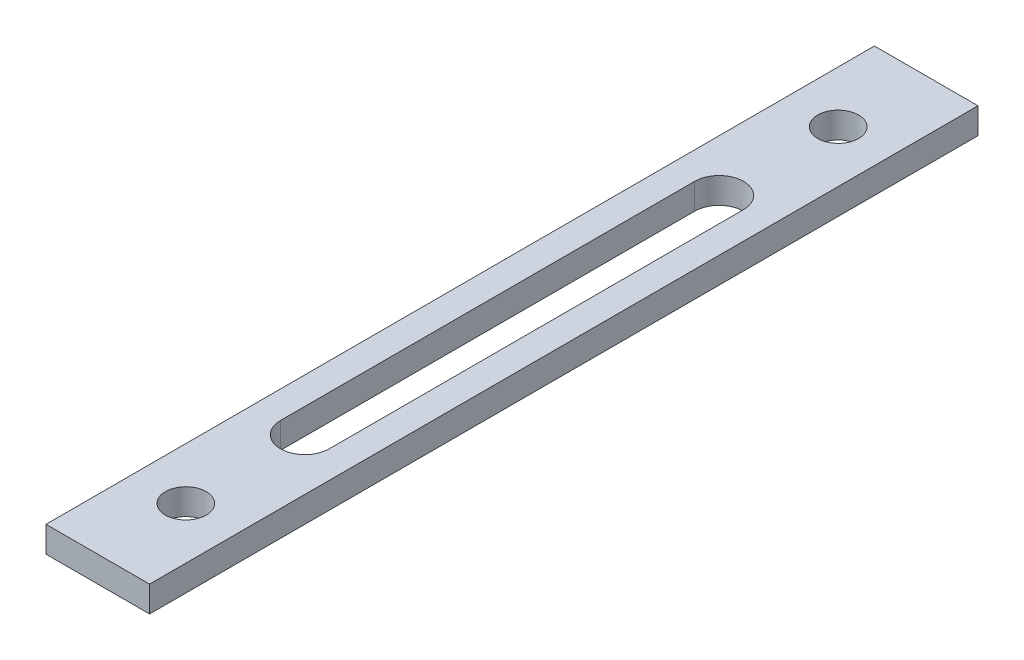
ISO-10303-21;
HEADER;
FILE_DESCRIPTION(('STEP AP214'),'2;1');
FILE_NAME('part.step','',(''),(''),'','','');
FILE_SCHEMA(('AUTOMOTIVE_DESIGN { 1 0 10303 214 1 1 1 1 }'));
ENDSEC;
DATA;
#1=APPLICATION_CONTEXT('core data for automotive mechanical design processes');
#2=APPLICATION_PROTOCOL_DEFINITION('international standard','automotive_design',2000,#1);
#3=PRODUCT_CONTEXT('',#1,'mechanical');
#4=PRODUCT('Part','Part','',(#3));
#5=PRODUCT_RELATED_PRODUCT_CATEGORY('part','',(#4));
#6=PRODUCT_DEFINITION_FORMATION('','',#4);
#7=PRODUCT_DEFINITION_CONTEXT('part definition',#1,'design');
#8=PRODUCT_DEFINITION('design','',#6,#7);
#9=PRODUCT_DEFINITION_SHAPE('','',#8);
#10=(LENGTH_UNIT() NAMED_UNIT(*) SI_UNIT(.MILLI.,.METRE.));
#11=(NAMED_UNIT(*) PLANE_ANGLE_UNIT() SI_UNIT($,.RADIAN.));
#12=(NAMED_UNIT(*) SI_UNIT($,.STERADIAN.) SOLID_ANGLE_UNIT());
#13=UNCERTAINTY_MEASURE_WITH_UNIT(LENGTH_MEASURE(1.E-05),#10,'distance_accuracy_value','');
#14=(GEOMETRIC_REPRESENTATION_CONTEXT(3) GLOBAL_UNCERTAINTY_ASSIGNED_CONTEXT((#13)) GLOBAL_UNIT_ASSIGNED_CONTEXT((#10,
#11,#12)) REPRESENTATION_CONTEXT('',''));
#15=CARTESIAN_POINT('',(0.,0.,0.));
#16=DIRECTION('',(0.,0.,1.));
#17=DIRECTION('',(1.,0.,0.));
#18=AXIS2_PLACEMENT_3D('',#15,#16,#17);
#19=CARTESIAN_POINT('',(-12.7,6.35,-101.6));
#20=DIRECTION('',(1.,0.,0.));
#21=DIRECTION('',(0.,0.,-1.));
#22=AXIS2_PLACEMENT_3D('',#19,#20,#21);
#23=PLANE('',#22);
#24=DIRECTION('',(0.,0.,1.));
#25=VECTOR('',#24,1.);
#26=CARTESIAN_POINT('',(-12.7,0.,-101.6));
#27=LINE('',#26,#25);
#28=CARTESIAN_POINT('',(-12.7,0.,-101.6));
#29=VERTEX_POINT('',#28);
#30=CARTESIAN_POINT('',(-12.7,0.,101.6));
#31=VERTEX_POINT('',#30);
#32=EDGE_CURVE('E142',#29,#31,#27,.T.);
#33=ORIENTED_EDGE('',*,*,#32,.T.);
#34=DIRECTION('',(0.,-1.,0.));
#35=VECTOR('',#34,1.);
#36=CARTESIAN_POINT('',(-12.7,6.35,101.6));
#37=LINE('',#36,#35);
#38=CARTESIAN_POINT('',(-12.7,6.35,101.6));
#39=VERTEX_POINT('',#38);
#40=EDGE_CURVE('E11',#39,#31,#37,.T.);
#41=ORIENTED_EDGE('',*,*,#40,.F.);
#42=DIRECTION('',(0.,0.,1.));
#43=VECTOR('',#42,1.);
#44=CARTESIAN_POINT('',(-12.7,6.35,-101.6));
#45=LINE('',#44,#43);
#46=CARTESIAN_POINT('',(-12.7,6.35,-101.6));
#47=VERTEX_POINT('',#46);
#48=EDGE_CURVE('E151',#47,#39,#45,.T.);
#49=ORIENTED_EDGE('',*,*,#48,.F.);
#50=DIRECTION('',(0.,-1.,0.));
#51=VECTOR('',#50,1.);
#52=CARTESIAN_POINT('',(-12.7,6.35,-101.6));
#53=LINE('',#52,#51);
#54=EDGE_CURVE('E161',#47,#29,#53,.T.);
#55=ORIENTED_EDGE('',*,*,#54,.T.);
#56=EDGE_LOOP('',(#33,#41,#49,#55));
#57=FACE_BOUND('',#56,.T.);
#58=ADVANCED_FACE('F38',(#57),#23,.F.);
#59=CARTESIAN_POINT('',(12.7,6.35,101.6));
#60=DIRECTION('',(0.,0.,-1.));
#61=DIRECTION('',(-1.,0.,0.));
#62=AXIS2_PLACEMENT_3D('',#59,#60,#61);
#63=PLANE('',#62);
#64=DIRECTION('',(1.,0.,0.));
#65=VECTOR('',#64,1.);
#66=CARTESIAN_POINT('',(12.7,0.,101.6));
#67=LINE('',#66,#65);
#68=CARTESIAN_POINT('',(12.7,0.,101.6));
#69=VERTEX_POINT('',#68);
#70=EDGE_CURVE('E164',#31,#69,#67,.T.);
#71=ORIENTED_EDGE('',*,*,#70,.T.);
#72=DIRECTION('',(0.,-1.,0.));
#73=VECTOR('',#72,1.);
#74=CARTESIAN_POINT('',(12.7,6.35,101.6));
#75=LINE('',#74,#73);
#76=CARTESIAN_POINT('',(12.7,6.35,101.6));
#77=VERTEX_POINT('',#76);
#78=EDGE_CURVE('E45',#77,#69,#75,.T.);
#79=ORIENTED_EDGE('',*,*,#78,.F.);
#80=DIRECTION('',(1.,0.,0.));
#81=VECTOR('',#80,1.);
#82=CARTESIAN_POINT('',(12.7,6.35,101.6));
#83=LINE('',#82,#81);
#84=EDGE_CURVE('E154',#39,#77,#83,.T.);
#85=ORIENTED_EDGE('',*,*,#84,.F.);
#86=ORIENTED_EDGE('',*,*,#40,.T.);
#87=EDGE_LOOP('',(#71,#79,#85,#86));
#88=FACE_BOUND('',#87,.T.);
#89=ADVANCED_FACE('F193',(#88),#63,.F.);
#90=CARTESIAN_POINT('',(12.7,6.35,-101.6));
#91=DIRECTION('',(-1.,0.,0.));
#92=DIRECTION('',(0.,0.,1.));
#93=AXIS2_PLACEMENT_3D('',#90,#91,#92);
#94=PLANE('',#93);
#95=DIRECTION('',(0.,0.,-1.));
#96=VECTOR('',#95,1.);
#97=CARTESIAN_POINT('',(12.7,0.,-101.6));
#98=LINE('',#97,#96);
#99=CARTESIAN_POINT('',(12.7,0.,-101.6));
#100=VERTEX_POINT('',#99);
#101=EDGE_CURVE('E166',#69,#100,#98,.T.);
#102=ORIENTED_EDGE('',*,*,#101,.T.);
#103=DIRECTION('',(0.,-1.,0.));
#104=VECTOR('',#103,1.);
#105=CARTESIAN_POINT('',(12.7,6.35,-101.6));
#106=LINE('',#105,#104);
#107=CARTESIAN_POINT('',(12.7,6.35,-101.6));
#108=VERTEX_POINT('',#107);
#109=EDGE_CURVE('E171',#108,#100,#106,.T.);
#110=ORIENTED_EDGE('',*,*,#109,.F.);
#111=DIRECTION('',(0.,0.,-1.));
#112=VECTOR('',#111,1.);
#113=CARTESIAN_POINT('',(12.7,6.35,-101.6));
#114=LINE('',#113,#112);
#115=EDGE_CURVE('E157',#77,#108,#114,.T.);
#116=ORIENTED_EDGE('',*,*,#115,.F.);
#117=ORIENTED_EDGE('',*,*,#78,.T.);
#118=EDGE_LOOP('',(#102,#110,#116,#117));
#119=FACE_BOUND('',#118,.T.);
#120=ADVANCED_FACE('F178',(#119),#94,.F.);
#121=CARTESIAN_POINT('',(12.7,6.35,-101.6));
#122=DIRECTION('',(0.,0.,1.));
#123=DIRECTION('',(1.,0.,0.));
#124=AXIS2_PLACEMENT_3D('',#121,#122,#123);
#125=PLANE('',#124);
#126=DIRECTION('',(-1.,0.,0.));
#127=VECTOR('',#126,1.);
#128=CARTESIAN_POINT('',(12.7,0.,-101.6));
#129=LINE('',#128,#127);
#130=EDGE_CURVE('E155',#100,#29,#129,.T.);
#131=ORIENTED_EDGE('',*,*,#130,.T.);
#132=ORIENTED_EDGE('',*,*,#54,.F.);
#133=DIRECTION('',(-1.,0.,0.));
#134=VECTOR('',#133,1.);
#135=CARTESIAN_POINT('',(12.7,6.35,-101.6));
#136=LINE('',#135,#134);
#137=EDGE_CURVE('E159',#108,#47,#136,.T.);
#138=ORIENTED_EDGE('',*,*,#137,.F.);
#139=ORIENTED_EDGE('',*,*,#109,.T.);
#140=EDGE_LOOP('',(#131,#132,#138,#139));
#141=FACE_BOUND('',#140,.T.);
#142=ADVANCED_FACE('F186',(#141),#125,.F.);
#143=CARTESIAN_POINT('',(0.,6.35,0.));
#144=DIRECTION('',(0.,-1.,0.));
#145=DIRECTION('',(0.,0.,-1.));
#146=AXIS2_PLACEMENT_3D('',#143,#144,#145);
#147=PLANE('',#146);
#148=DIRECTION('',(0.,0.,1.));
#149=VECTOR('',#148,1.);
#150=CARTESIAN_POINT('',(-6.00000000000002,6.35,-50.8));
#151=LINE('',#150,#149);
#152=CARTESIAN_POINT('',(-6.00000000000002,6.35,-50.8));
#153=VERTEX_POINT('',#152);
#154=CARTESIAN_POINT('',(-5.99999999999999,6.35,50.8));
#155=VERTEX_POINT('',#154);
#156=EDGE_CURVE('E129',#153,#155,#151,.T.);
#157=ORIENTED_EDGE('',*,*,#156,.F.);
#158=CARTESIAN_POINT('',(0.,6.35,-50.8));
#159=DIRECTION('',(0.,1.,0.));
#160=DIRECTION('',(0.,0.,1.));
#161=AXIS2_PLACEMENT_3D('',#158,#159,#160);
#162=CIRCLE('',#161,6.);
#163=CARTESIAN_POINT('',(5.99999999999998,6.35,-50.8));
#164=VERTEX_POINT('',#163);
#165=EDGE_CURVE('E52',#164,#153,#162,.T.);
#166=ORIENTED_EDGE('',*,*,#165,.F.);
#167=DIRECTION('',(0.,0.,-1.));
#168=VECTOR('',#167,1.);
#169=CARTESIAN_POINT('',(5.99999999999998,6.35,-50.8));
#170=LINE('',#169,#168);
#171=CARTESIAN_POINT('',(6.00000000000001,6.35,50.8));
#172=VERTEX_POINT('',#171);
#173=EDGE_CURVE('E120',#172,#164,#170,.T.);
#174=ORIENTED_EDGE('',*,*,#173,.F.);
#175=CARTESIAN_POINT('',(0.,6.35,50.8));
#176=DIRECTION('',(0.,1.,0.));
#177=DIRECTION('',(0.,0.,1.));
#178=AXIS2_PLACEMENT_3D('',#175,#176,#177);
#179=CIRCLE('',#178,6.);
#180=EDGE_CURVE('E123',#155,#172,#179,.T.);
#181=ORIENTED_EDGE('',*,*,#180,.F.);
#182=EDGE_LOOP('',(#157,#166,#174,#181));
#183=FACE_BOUND('',#182,.T.);
#184=CARTESIAN_POINT('',(0.,6.35,80.));
#185=DIRECTION('',(0.,1.,0.));
#186=DIRECTION('',(0.,0.,1.));
#187=AXIS2_PLACEMENT_3D('',#184,#185,#186);
#188=CIRCLE('',#187,5.);
#189=CARTESIAN_POINT('',(0.,6.35,85.));
#190=VERTEX_POINT('',#189);
#191=EDGE_CURVE('E143',#190,#190,#188,.T.);
#192=ORIENTED_EDGE('',*,*,#191,.F.);
#193=EDGE_LOOP('',(#192));
#194=FACE_BOUND('',#193,.T.);
#195=CARTESIAN_POINT('',(0.,6.35,-80.));
#196=DIRECTION('',(0.,1.,0.));
#197=DIRECTION('',(0.,0.,1.));
#198=AXIS2_PLACEMENT_3D('',#195,#196,#197);
#199=CIRCLE('',#198,5.);
#200=CARTESIAN_POINT('',(0.,6.35,-75.));
#201=VERTEX_POINT('',#200);
#202=EDGE_CURVE('E135',#201,#201,#199,.T.);
#203=ORIENTED_EDGE('',*,*,#202,.F.);
#204=EDGE_LOOP('',(#203));
#205=FACE_BOUND('',#204,.T.);
#206=ORIENTED_EDGE('',*,*,#48,.T.);
#207=ORIENTED_EDGE('',*,*,#84,.T.);
#208=ORIENTED_EDGE('',*,*,#115,.T.);
#209=ORIENTED_EDGE('',*,*,#137,.T.);
#210=EDGE_LOOP('',(#206,#207,#208,#209));
#211=FACE_BOUND('',#210,.T.);
#212=ADVANCED_FACE('F192',(#183,#194,#205,#211),#147,.F.);
#213=CARTESIAN_POINT('',(0.,0.,0.));
#214=DIRECTION('',(0.,-1.,0.));
#215=DIRECTION('',(0.,0.,-1.));
#216=AXIS2_PLACEMENT_3D('',#213,#214,#215);
#217=PLANE('',#216);
#218=CARTESIAN_POINT('',(0.,0.,-50.8));
#219=DIRECTION('',(0.,1.,0.));
#220=DIRECTION('',(0.,0.,1.));
#221=AXIS2_PLACEMENT_3D('',#218,#219,#220);
#222=CIRCLE('',#221,6.);
#223=CARTESIAN_POINT('',(5.99999999999998,0.,-50.8));
#224=VERTEX_POINT('',#223);
#225=CARTESIAN_POINT('',(-6.00000000000002,0.,-50.8));
#226=VERTEX_POINT('',#225);
#227=EDGE_CURVE('E104',#224,#226,#222,.T.);
#228=ORIENTED_EDGE('',*,*,#227,.T.);
#229=DIRECTION('',(0.,0.,1.));
#230=VECTOR('',#229,1.);
#231=CARTESIAN_POINT('',(-6.00000000000002,0.,-50.8));
#232=LINE('',#231,#230);
#233=CARTESIAN_POINT('',(-5.99999999999999,0.,50.8));
#234=VERTEX_POINT('',#233);
#235=EDGE_CURVE('E113',#226,#234,#232,.T.);
#236=ORIENTED_EDGE('',*,*,#235,.T.);
#237=CARTESIAN_POINT('',(0.,0.,50.8));
#238=DIRECTION('',(0.,1.,0.));
#239=DIRECTION('',(0.,0.,1.));
#240=AXIS2_PLACEMENT_3D('',#237,#238,#239);
#241=CIRCLE('',#240,6.);
#242=CARTESIAN_POINT('',(6.00000000000001,0.,50.8));
#243=VERTEX_POINT('',#242);
#244=EDGE_CURVE('E60',#234,#243,#241,.T.);
#245=ORIENTED_EDGE('',*,*,#244,.T.);
#246=DIRECTION('',(0.,0.,-1.));
#247=VECTOR('',#246,1.);
#248=CARTESIAN_POINT('',(5.99999999999998,0.,-50.8));
#249=LINE('',#248,#247);
#250=EDGE_CURVE('E110',#243,#224,#249,.T.);
#251=ORIENTED_EDGE('',*,*,#250,.T.);
#252=EDGE_LOOP('',(#228,#236,#245,#251));
#253=FACE_BOUND('',#252,.T.);
#254=CARTESIAN_POINT('',(0.,0.,80.));
#255=DIRECTION('',(0.,1.,0.));
#256=DIRECTION('',(0.,0.,1.));
#257=AXIS2_PLACEMENT_3D('',#254,#255,#256);
#258=CIRCLE('',#257,5.);
#259=CARTESIAN_POINT('',(0.,0.,85.));
#260=VERTEX_POINT('',#259);
#261=EDGE_CURVE('E139',#260,#260,#258,.T.);
#262=ORIENTED_EDGE('',*,*,#261,.T.);
#263=EDGE_LOOP('',(#262));
#264=FACE_BOUND('',#263,.T.);
#265=CARTESIAN_POINT('',(0.,0.,-80.));
#266=DIRECTION('',(0.,1.,0.));
#267=DIRECTION('',(0.,0.,1.));
#268=AXIS2_PLACEMENT_3D('',#265,#266,#267);
#269=CIRCLE('',#268,5.);
#270=CARTESIAN_POINT('',(0.,0.,-75.));
#271=VERTEX_POINT('',#270);
#272=EDGE_CURVE('E146',#271,#271,#269,.T.);
#273=ORIENTED_EDGE('',*,*,#272,.T.);
#274=EDGE_LOOP('',(#273));
#275=FACE_BOUND('',#274,.T.);
#276=ORIENTED_EDGE('',*,*,#32,.F.);
#277=ORIENTED_EDGE('',*,*,#130,.F.);
#278=ORIENTED_EDGE('',*,*,#101,.F.);
#279=ORIENTED_EDGE('',*,*,#70,.F.);
#280=EDGE_LOOP('',(#276,#277,#278,#279));
#281=FACE_BOUND('',#280,.T.);
#282=ADVANCED_FACE('F117',(#253,#264,#275,#281),#217,.T.);
#283=CARTESIAN_POINT('',(0.,0.,-80.));
#284=DIRECTION('',(0.,1.,0.));
#285=DIRECTION('',(0.,0.,1.));
#286=AXIS2_PLACEMENT_3D('',#283,#284,#285);
#287=CYLINDRICAL_SURFACE('',#286,5.);
#288=ORIENTED_EDGE('',*,*,#272,.F.);
#289=EDGE_LOOP('',(#288));
#290=FACE_BOUND('',#289,.T.);
#291=ORIENTED_EDGE('',*,*,#202,.T.);
#292=EDGE_LOOP('',(#291));
#293=FACE_BOUND('',#292,.T.);
#294=ADVANCED_FACE('F205',(#290,#293),#287,.F.);
#295=CARTESIAN_POINT('',(0.,0.,80.));
#296=DIRECTION('',(0.,1.,0.));
#297=DIRECTION('',(0.,0.,1.));
#298=AXIS2_PLACEMENT_3D('',#295,#296,#297);
#299=CYLINDRICAL_SURFACE('',#298,5.);
#300=ORIENTED_EDGE('',*,*,#261,.F.);
#301=EDGE_LOOP('',(#300));
#302=FACE_BOUND('',#301,.T.);
#303=ORIENTED_EDGE('',*,*,#191,.T.);
#304=EDGE_LOOP('',(#303));
#305=FACE_BOUND('',#304,.T.);
#306=ADVANCED_FACE('F211',(#302,#305),#299,.F.);
#307=CARTESIAN_POINT('',(0.,0.,-50.8));
#308=DIRECTION('',(0.,1.,0.));
#309=DIRECTION('',(0.,0.,1.));
#310=AXIS2_PLACEMENT_3D('',#307,#308,#309);
#311=CYLINDRICAL_SURFACE('',#310,6.);
#312=ORIENTED_EDGE('',*,*,#165,.T.);
#313=DIRECTION('',(0.,1.,0.));
#314=VECTOR('',#313,1.);
#315=CARTESIAN_POINT('',(-6.00000000000002,0.,-50.8));
#316=LINE('',#315,#314);
#317=EDGE_CURVE('E100',#226,#153,#316,.T.);
#318=ORIENTED_EDGE('',*,*,#317,.F.);
#319=ORIENTED_EDGE('',*,*,#227,.F.);
#320=DIRECTION('',(0.,1.,0.));
#321=VECTOR('',#320,1.);
#322=CARTESIAN_POINT('',(5.99999999999998,0.,-50.8));
#323=LINE('',#322,#321);
#324=EDGE_CURVE('E133',#224,#164,#323,.T.);
#325=ORIENTED_EDGE('',*,*,#324,.T.);
#326=EDGE_LOOP('',(#312,#318,#319,#325));
#327=FACE_BOUND('',#326,.T.);
#328=ADVANCED_FACE('F102',(#327),#311,.F.);
#329=CARTESIAN_POINT('',(5.99999999999998,0.,-50.8));
#330=DIRECTION('',(1.,0.,0.));
#331=DIRECTION('',(0.,0.,-1.));
#332=AXIS2_PLACEMENT_3D('',#329,#330,#331);
#333=PLANE('',#332);
#334=ORIENTED_EDGE('',*,*,#173,.T.);
#335=ORIENTED_EDGE('',*,*,#324,.F.);
#336=ORIENTED_EDGE('',*,*,#250,.F.);
#337=DIRECTION('',(0.,1.,0.));
#338=VECTOR('',#337,1.);
#339=CARTESIAN_POINT('',(6.00000000000001,0.,50.8));
#340=LINE('',#339,#338);
#341=EDGE_CURVE('E136',#243,#172,#340,.T.);
#342=ORIENTED_EDGE('',*,*,#341,.T.);
#343=EDGE_LOOP('',(#334,#335,#336,#342));
#344=FACE_BOUND('',#343,.T.);
#345=ADVANCED_FACE('F218',(#344),#333,.F.);
#346=CARTESIAN_POINT('',(0.,0.,50.8));
#347=DIRECTION('',(0.,1.,0.));
#348=DIRECTION('',(0.,0.,1.));
#349=AXIS2_PLACEMENT_3D('',#346,#347,#348);
#350=CYLINDRICAL_SURFACE('',#349,6.);
#351=ORIENTED_EDGE('',*,*,#180,.T.);
#352=ORIENTED_EDGE('',*,*,#341,.F.);
#353=ORIENTED_EDGE('',*,*,#244,.F.);
#354=DIRECTION('',(0.,1.,0.));
#355=VECTOR('',#354,1.);
#356=CARTESIAN_POINT('',(-5.99999999999999,0.,50.8));
#357=LINE('',#356,#355);
#358=EDGE_CURVE('E109',#234,#155,#357,.T.);
#359=ORIENTED_EDGE('',*,*,#358,.T.);
#360=EDGE_LOOP('',(#351,#352,#353,#359));
#361=FACE_BOUND('',#360,.T.);
#362=ADVANCED_FACE('F221',(#361),#350,.F.);
#363=CARTESIAN_POINT('',(-6.00000000000002,0.,-50.8));
#364=DIRECTION('',(-1.,0.,0.));
#365=DIRECTION('',(0.,0.,1.));
#366=AXIS2_PLACEMENT_3D('',#363,#364,#365);
#367=PLANE('',#366);
#368=ORIENTED_EDGE('',*,*,#156,.T.);
#369=ORIENTED_EDGE('',*,*,#358,.F.);
#370=ORIENTED_EDGE('',*,*,#235,.F.);
#371=ORIENTED_EDGE('',*,*,#317,.T.);
#372=EDGE_LOOP('',(#368,#369,#370,#371));
#373=FACE_BOUND('',#372,.T.);
#374=ADVANCED_FACE('F114',(#373),#367,.F.);
#375=CLOSED_SHELL('',(#58,#89,#120,#142,#212,#282,#294,#306,#328,#345,#362,#374));
#376=MANIFOLD_SOLID_BREP('B2',#375);
#377=ADVANCED_BREP_SHAPE_REPRESENTATION('',(#18,#376),#14);
#378=SHAPE_DEFINITION_REPRESENTATION(#9,#377);
ENDSEC;
END-ISO-10303-21;
